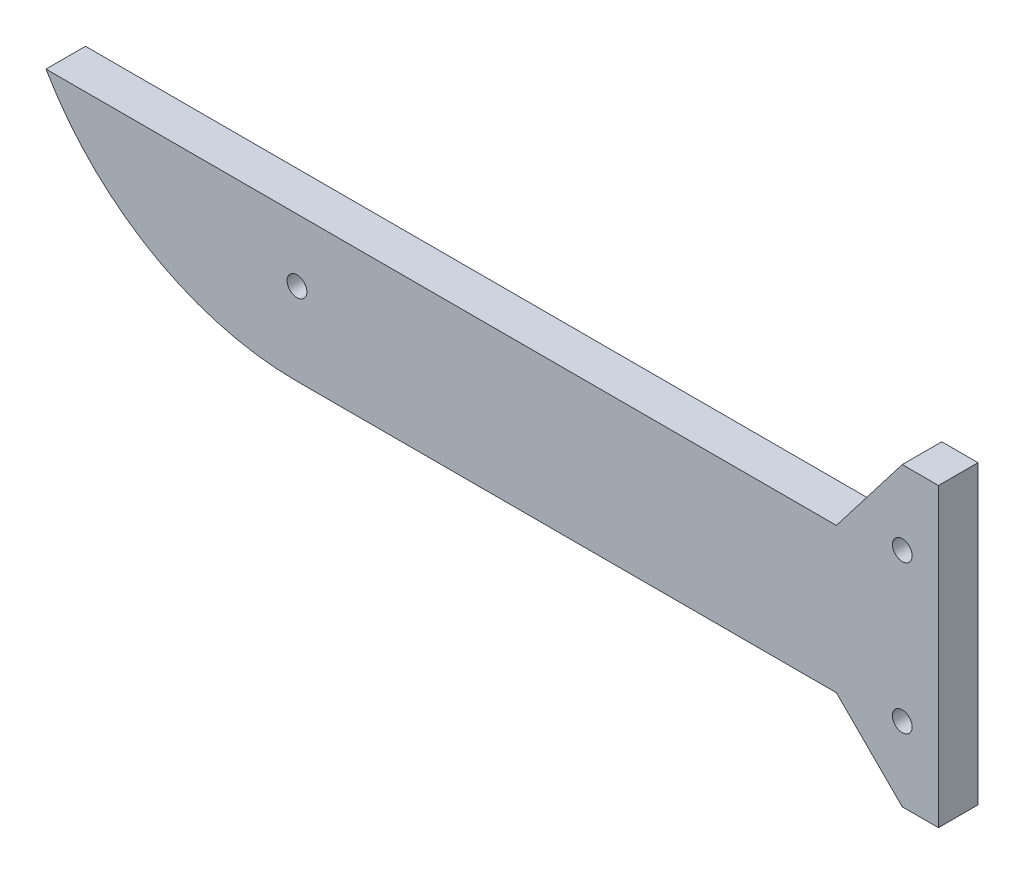
ISO-10303-21;
HEADER;
FILE_DESCRIPTION(('STEP AP214'),'2;1');
FILE_NAME('part.step','',(''),(''),'','','');
FILE_SCHEMA(('AUTOMOTIVE_DESIGN { 1 0 10303 214 1 1 1 1 }'));
ENDSEC;
DATA;
#1=APPLICATION_CONTEXT('core data for automotive mechanical design processes');
#2=APPLICATION_PROTOCOL_DEFINITION('international standard','automotive_design',2000,#1);
#3=PRODUCT_CONTEXT('',#1,'mechanical');
#4=PRODUCT('Part','Part','',(#3));
#5=PRODUCT_RELATED_PRODUCT_CATEGORY('part','',(#4));
#6=PRODUCT_DEFINITION_FORMATION('','',#4);
#7=PRODUCT_DEFINITION_CONTEXT('part definition',#1,'design');
#8=PRODUCT_DEFINITION('design','',#6,#7);
#9=PRODUCT_DEFINITION_SHAPE('','',#8);
#10=(LENGTH_UNIT() NAMED_UNIT(*) SI_UNIT(.MILLI.,.METRE.));
#11=(NAMED_UNIT(*) PLANE_ANGLE_UNIT() SI_UNIT($,.RADIAN.));
#12=(NAMED_UNIT(*) SI_UNIT($,.STERADIAN.) SOLID_ANGLE_UNIT());
#13=UNCERTAINTY_MEASURE_WITH_UNIT(LENGTH_MEASURE(1.E-05),#10,'distance_accuracy_value','');
#14=(GEOMETRIC_REPRESENTATION_CONTEXT(3) GLOBAL_UNCERTAINTY_ASSIGNED_CONTEXT((#13)) GLOBAL_UNIT_ASSIGNED_CONTEXT((#10,
#11,#12)) REPRESENTATION_CONTEXT('',''));
#15=CARTESIAN_POINT('',(0.,0.,0.));
#16=DIRECTION('',(0.,0.,1.));
#17=DIRECTION('',(1.,0.,0.));
#18=AXIS2_PLACEMENT_3D('',#15,#16,#17);
#19=CARTESIAN_POINT('',(38.1051177665153,19.,6.));
#20=DIRECTION('',(0.,0.,1.));
#21=DIRECTION('',(1.,0.,0.));
#22=AXIS2_PLACEMENT_3D('',#19,#20,#21);
#23=PLANE('',#22);
#24=CARTESIAN_POINT('',(130.,-23.75,6.));
#25=DIRECTION('',(0.,0.,1.));
#26=DIRECTION('',(1.,0.,0.));
#27=AXIS2_PLACEMENT_3D('',#24,#25,#26);
#28=CIRCLE('',#27,1.5);
#29=CARTESIAN_POINT('',(131.5,-23.75,6.));
#30=VERTEX_POINT('',#29);
#31=EDGE_CURVE('E179',#30,#30,#28,.T.);
#32=ORIENTED_EDGE('',*,*,#31,.F.);
#33=EDGE_LOOP('',(#32));
#34=FACE_BOUND('',#33,.T.);
#35=CARTESIAN_POINT('',(38.1051177665153,19.,6.));
#36=DIRECTION('',(0.,0.,1.));
#37=DIRECTION('',(1.,0.,0.));
#38=AXIS2_PLACEMENT_3D('',#35,#36,#37);
#39=CIRCLE('',#38,44.);
#40=CARTESIAN_POINT('',(0.,-3.,6.));
#41=VERTEX_POINT('',#40);
#42=CARTESIAN_POINT('',(38.1051177665153,-25.,6.));
#43=VERTEX_POINT('',#42);
#44=EDGE_CURVE('E142',#41,#43,#39,.T.);
#45=ORIENTED_EDGE('',*,*,#44,.T.);
#46=DIRECTION('',(1.,0.,0.));
#47=VECTOR('',#46,1.);
#48=CARTESIAN_POINT('',(120.,-25.,6.));
#49=LINE('',#48,#47);
#50=CARTESIAN_POINT('',(120.,-25.,6.));
#51=VERTEX_POINT('',#50);
#52=EDGE_CURVE('E90',#43,#51,#49,.T.);
#53=ORIENTED_EDGE('',*,*,#52,.T.);
#54=DIRECTION('',(0.707106781186546,-0.707106781186549,0.));
#55=VECTOR('',#54,1.);
#56=CARTESIAN_POINT('',(130.,-35.,6.));
#57=LINE('',#56,#55);
#58=CARTESIAN_POINT('',(130.,-35.,6.));
#59=VERTEX_POINT('',#58);
#60=EDGE_CURVE('E157',#51,#59,#57,.T.);
#61=ORIENTED_EDGE('',*,*,#60,.T.);
#62=DIRECTION('',(1.,0.,0.));
#63=VECTOR('',#62,1.);
#64=CARTESIAN_POINT('',(135.5,-35.,6.));
#65=LINE('',#64,#63);
#66=CARTESIAN_POINT('',(135.5,-35.,6.));
#67=VERTEX_POINT('',#66);
#68=EDGE_CURVE('E170',#59,#67,#65,.T.);
#69=ORIENTED_EDGE('',*,*,#68,.T.);
#70=DIRECTION('',(0.,1.,0.));
#71=VECTOR('',#70,1.);
#72=CARTESIAN_POINT('',(135.5,10.,6.));
#73=LINE('',#72,#71);
#74=CARTESIAN_POINT('',(135.5,10.,6.));
#75=VERTEX_POINT('',#74);
#76=EDGE_CURVE('E109',#67,#75,#73,.T.);
#77=ORIENTED_EDGE('',*,*,#76,.T.);
#78=DIRECTION('',(-1.,0.,0.));
#79=VECTOR('',#78,1.);
#80=CARTESIAN_POINT('',(130.,10.,6.));
#81=LINE('',#80,#79);
#82=CARTESIAN_POINT('',(130.,10.,6.));
#83=VERTEX_POINT('',#82);
#84=EDGE_CURVE('E103',#75,#83,#81,.T.);
#85=ORIENTED_EDGE('',*,*,#84,.T.);
#86=DIRECTION('',(-0.60971076084969,-0.792623989104602,0.));
#87=VECTOR('',#86,1.);
#88=CARTESIAN_POINT('',(120.,-3.,6.));
#89=LINE('',#88,#87);
#90=CARTESIAN_POINT('',(120.,-3.,6.));
#91=VERTEX_POINT('',#90);
#92=EDGE_CURVE('E107',#83,#91,#89,.T.);
#93=ORIENTED_EDGE('',*,*,#92,.T.);
#94=DIRECTION('',(-1.,0.,0.));
#95=VECTOR('',#94,1.);
#96=CARTESIAN_POINT('',(0.,-3.,6.));
#97=LINE('',#96,#95);
#98=EDGE_CURVE('E47',#91,#41,#97,.T.);
#99=ORIENTED_EDGE('',*,*,#98,.T.);
#100=EDGE_LOOP('',(#45,#53,#61,#69,#77,#85,#93,#99));
#101=FACE_BOUND('',#100,.T.);
#102=CARTESIAN_POINT('',(130.,-1.25,6.));
#103=DIRECTION('',(0.,0.,1.));
#104=DIRECTION('',(1.,0.,0.));
#105=AXIS2_PLACEMENT_3D('',#102,#103,#104);
#106=CIRCLE('',#105,1.5);
#107=CARTESIAN_POINT('',(131.5,-1.25,6.));
#108=VERTEX_POINT('',#107);
#109=EDGE_CURVE('E131',#108,#108,#106,.T.);
#110=ORIENTED_EDGE('',*,*,#109,.F.);
#111=EDGE_LOOP('',(#110));
#112=FACE_BOUND('',#111,.T.);
#113=CARTESIAN_POINT('',(38.1051177665153,-12.5,6.));
#114=DIRECTION('',(0.,0.,1.));
#115=DIRECTION('',(1.,0.,0.));
#116=AXIS2_PLACEMENT_3D('',#113,#114,#115);
#117=CIRCLE('',#116,1.5);
#118=CARTESIAN_POINT('',(39.6051177665153,-12.5,6.));
#119=VERTEX_POINT('',#118);
#120=EDGE_CURVE('E185',#119,#119,#117,.T.);
#121=ORIENTED_EDGE('',*,*,#120,.F.);
#122=EDGE_LOOP('',(#121));
#123=FACE_BOUND('',#122,.T.);
#124=ADVANCED_FACE('F30',(#34,#101,#112,#123),#23,.T.);
#125=CARTESIAN_POINT('',(38.1051177665153,19.,0.));
#126=DIRECTION('',(0.,0.,1.));
#127=DIRECTION('',(1.,0.,0.));
#128=AXIS2_PLACEMENT_3D('',#125,#126,#127);
#129=PLANE('',#128);
#130=CARTESIAN_POINT('',(38.1051177665153,19.,0.));
#131=DIRECTION('',(0.,0.,1.));
#132=DIRECTION('',(1.,0.,0.));
#133=AXIS2_PLACEMENT_3D('',#130,#131,#132);
#134=CIRCLE('',#133,44.);
#135=CARTESIAN_POINT('',(0.,-3.,0.));
#136=VERTEX_POINT('',#135);
#137=CARTESIAN_POINT('',(38.1051177665153,-25.,0.));
#138=VERTEX_POINT('',#137);
#139=EDGE_CURVE('E127',#136,#138,#134,.T.);
#140=ORIENTED_EDGE('',*,*,#139,.F.);
#141=DIRECTION('',(-1.,0.,0.));
#142=VECTOR('',#141,1.);
#143=CARTESIAN_POINT('',(0.,-3.,0.));
#144=LINE('',#143,#142);
#145=CARTESIAN_POINT('',(120.,-3.,0.));
#146=VERTEX_POINT('',#145);
#147=EDGE_CURVE('E82',#146,#136,#144,.T.);
#148=ORIENTED_EDGE('',*,*,#147,.F.);
#149=DIRECTION('',(-0.60971076084969,-0.792623989104602,0.));
#150=VECTOR('',#149,1.);
#151=CARTESIAN_POINT('',(120.,-3.,0.));
#152=LINE('',#151,#150);
#153=CARTESIAN_POINT('',(130.,10.,0.));
#154=VERTEX_POINT('',#153);
#155=EDGE_CURVE('E76',#154,#146,#152,.T.);
#156=ORIENTED_EDGE('',*,*,#155,.F.);
#157=DIRECTION('',(-1.,0.,0.));
#158=VECTOR('',#157,1.);
#159=CARTESIAN_POINT('',(130.,10.,0.));
#160=LINE('',#159,#158);
#161=CARTESIAN_POINT('',(135.5,10.,0.));
#162=VERTEX_POINT('',#161);
#163=EDGE_CURVE('E117',#162,#154,#160,.T.);
#164=ORIENTED_EDGE('',*,*,#163,.F.);
#165=DIRECTION('',(0.,1.,0.));
#166=VECTOR('',#165,1.);
#167=CARTESIAN_POINT('',(135.5,10.,0.));
#168=LINE('',#167,#166);
#169=CARTESIAN_POINT('',(135.5,-35.,0.));
#170=VERTEX_POINT('',#169);
#171=EDGE_CURVE('E137',#170,#162,#168,.T.);
#172=ORIENTED_EDGE('',*,*,#171,.F.);
#173=DIRECTION('',(1.,0.,0.));
#174=VECTOR('',#173,1.);
#175=CARTESIAN_POINT('',(135.5,-35.,0.));
#176=LINE('',#175,#174);
#177=CARTESIAN_POINT('',(130.,-35.,0.));
#178=VERTEX_POINT('',#177);
#179=EDGE_CURVE('E135',#178,#170,#176,.T.);
#180=ORIENTED_EDGE('',*,*,#179,.F.);
#181=DIRECTION('',(0.707106781186546,-0.707106781186549,0.));
#182=VECTOR('',#181,1.);
#183=CARTESIAN_POINT('',(130.,-35.,0.));
#184=LINE('',#183,#182);
#185=CARTESIAN_POINT('',(120.,-25.,0.));
#186=VERTEX_POINT('',#185);
#187=EDGE_CURVE('E133',#186,#178,#184,.T.);
#188=ORIENTED_EDGE('',*,*,#187,.F.);
#189=DIRECTION('',(1.,0.,0.));
#190=VECTOR('',#189,1.);
#191=CARTESIAN_POINT('',(120.,-25.,0.));
#192=LINE('',#191,#190);
#193=EDGE_CURVE('E130',#138,#186,#192,.T.);
#194=ORIENTED_EDGE('',*,*,#193,.F.);
#195=EDGE_LOOP('',(#140,#148,#156,#164,#172,#180,#188,#194));
#196=FACE_BOUND('',#195,.T.);
#197=CARTESIAN_POINT('',(130.,-1.25,0.));
#198=DIRECTION('',(0.,0.,1.));
#199=DIRECTION('',(1.,0.,0.));
#200=AXIS2_PLACEMENT_3D('',#197,#198,#199);
#201=CIRCLE('',#200,1.5);
#202=CARTESIAN_POINT('',(131.5,-1.25,0.));
#203=VERTEX_POINT('',#202);
#204=EDGE_CURVE('E176',#203,#203,#201,.T.);
#205=ORIENTED_EDGE('',*,*,#204,.T.);
#206=EDGE_LOOP('',(#205));
#207=FACE_BOUND('',#206,.T.);
#208=CARTESIAN_POINT('',(130.,-23.75,0.));
#209=DIRECTION('',(0.,0.,1.));
#210=DIRECTION('',(1.,0.,0.));
#211=AXIS2_PLACEMENT_3D('',#208,#209,#210);
#212=CIRCLE('',#211,1.5);
#213=CARTESIAN_POINT('',(131.5,-23.75,0.));
#214=VERTEX_POINT('',#213);
#215=EDGE_CURVE('E182',#214,#214,#212,.T.);
#216=ORIENTED_EDGE('',*,*,#215,.T.);
#217=EDGE_LOOP('',(#216));
#218=FACE_BOUND('',#217,.T.);
#219=CARTESIAN_POINT('',(38.1051177665153,-12.5,0.));
#220=DIRECTION('',(0.,0.,1.));
#221=DIRECTION('',(1.,0.,0.));
#222=AXIS2_PLACEMENT_3D('',#219,#220,#221);
#223=CIRCLE('',#222,1.5);
#224=CARTESIAN_POINT('',(39.6051177665153,-12.5,0.));
#225=VERTEX_POINT('',#224);
#226=EDGE_CURVE('E188',#225,#225,#223,.T.);
#227=ORIENTED_EDGE('',*,*,#226,.T.);
#228=EDGE_LOOP('',(#227));
#229=FACE_BOUND('',#228,.T.);
#230=ADVANCED_FACE('F161',(#196,#207,#218,#229),#129,.F.);
#231=CARTESIAN_POINT('',(38.1051177665153,19.,6.));
#232=DIRECTION('',(0.,0.,-1.));
#233=DIRECTION('',(-1.,0.,0.));
#234=AXIS2_PLACEMENT_3D('',#231,#232,#233);
#235=CYLINDRICAL_SURFACE('',#234,44.);
#236=ORIENTED_EDGE('',*,*,#139,.T.);
#237=DIRECTION('',(0.,0.,-1.));
#238=VECTOR('',#237,1.);
#239=CARTESIAN_POINT('',(38.1051177665153,-25.,6.));
#240=LINE('',#239,#238);
#241=EDGE_CURVE('E11',#43,#138,#240,.T.);
#242=ORIENTED_EDGE('',*,*,#241,.F.);
#243=ORIENTED_EDGE('',*,*,#44,.F.);
#244=DIRECTION('',(0.,0.,-1.));
#245=VECTOR('',#244,1.);
#246=CARTESIAN_POINT('',(0.,-3.,6.));
#247=LINE('',#246,#245);
#248=EDGE_CURVE('E123',#41,#136,#247,.T.);
#249=ORIENTED_EDGE('',*,*,#248,.T.);
#250=EDGE_LOOP('',(#236,#242,#243,#249));
#251=FACE_BOUND('',#250,.T.);
#252=ADVANCED_FACE('F32',(#251),#235,.T.);
#253=CARTESIAN_POINT('',(120.,-25.,6.));
#254=DIRECTION('',(0.,1.,0.));
#255=DIRECTION('',(0.,0.,1.));
#256=AXIS2_PLACEMENT_3D('',#253,#254,#255);
#257=PLANE('',#256);
#258=ORIENTED_EDGE('',*,*,#193,.T.);
#259=DIRECTION('',(0.,0.,-1.));
#260=VECTOR('',#259,1.);
#261=CARTESIAN_POINT('',(120.,-25.,6.));
#262=LINE('',#261,#260);
#263=EDGE_CURVE('E39',#51,#186,#262,.T.);
#264=ORIENTED_EDGE('',*,*,#263,.F.);
#265=ORIENTED_EDGE('',*,*,#52,.F.);
#266=ORIENTED_EDGE('',*,*,#241,.T.);
#267=EDGE_LOOP('',(#258,#264,#265,#266));
#268=FACE_BOUND('',#267,.T.);
#269=ADVANCED_FACE('F221',(#268),#257,.F.);
#270=CARTESIAN_POINT('',(130.,-35.,6.));
#271=DIRECTION('',(0.707106781186549,0.707106781186545,0.));
#272=DIRECTION('',(-0.707106781186546,0.707106781186549,0.));
#273=AXIS2_PLACEMENT_3D('',#270,#271,#272);
#274=PLANE('',#273);
#275=ORIENTED_EDGE('',*,*,#187,.T.);
#276=DIRECTION('',(0.,0.,-1.));
#277=VECTOR('',#276,1.);
#278=CARTESIAN_POINT('',(130.,-35.,6.));
#279=LINE('',#278,#277);
#280=EDGE_CURVE('E149',#59,#178,#279,.T.);
#281=ORIENTED_EDGE('',*,*,#280,.F.);
#282=ORIENTED_EDGE('',*,*,#60,.F.);
#283=ORIENTED_EDGE('',*,*,#263,.T.);
#284=EDGE_LOOP('',(#275,#281,#282,#283));
#285=FACE_BOUND('',#284,.T.);
#286=ADVANCED_FACE('F155',(#285),#274,.F.);
#287=CARTESIAN_POINT('',(135.5,-35.,6.));
#288=DIRECTION('',(0.,1.,0.));
#289=DIRECTION('',(0.,0.,1.));
#290=AXIS2_PLACEMENT_3D('',#287,#288,#289);
#291=PLANE('',#290);
#292=ORIENTED_EDGE('',*,*,#179,.T.);
#293=DIRECTION('',(0.,0.,-1.));
#294=VECTOR('',#293,1.);
#295=CARTESIAN_POINT('',(135.5,-35.,6.));
#296=LINE('',#295,#294);
#297=EDGE_CURVE('E146',#67,#170,#296,.T.);
#298=ORIENTED_EDGE('',*,*,#297,.F.);
#299=ORIENTED_EDGE('',*,*,#68,.F.);
#300=ORIENTED_EDGE('',*,*,#280,.T.);
#301=EDGE_LOOP('',(#292,#298,#299,#300));
#302=FACE_BOUND('',#301,.T.);
#303=ADVANCED_FACE('F166',(#302),#291,.F.);
#304=CARTESIAN_POINT('',(135.5,10.,6.));
#305=DIRECTION('',(-1.,0.,0.));
#306=DIRECTION('',(0.,0.,1.));
#307=AXIS2_PLACEMENT_3D('',#304,#305,#306);
#308=PLANE('',#307);
#309=ORIENTED_EDGE('',*,*,#171,.T.);
#310=DIRECTION('',(0.,0.,-1.));
#311=VECTOR('',#310,1.);
#312=CARTESIAN_POINT('',(135.5,10.,6.));
#313=LINE('',#312,#311);
#314=EDGE_CURVE('E118',#75,#162,#313,.T.);
#315=ORIENTED_EDGE('',*,*,#314,.F.);
#316=ORIENTED_EDGE('',*,*,#76,.F.);
#317=ORIENTED_EDGE('',*,*,#297,.T.);
#318=EDGE_LOOP('',(#309,#315,#316,#317));
#319=FACE_BOUND('',#318,.T.);
#320=ADVANCED_FACE('F169',(#319),#308,.F.);
#321=CARTESIAN_POINT('',(130.,10.,6.));
#322=DIRECTION('',(0.,-1.,0.));
#323=DIRECTION('',(0.,0.,-1.));
#324=AXIS2_PLACEMENT_3D('',#321,#322,#323);
#325=PLANE('',#324);
#326=ORIENTED_EDGE('',*,*,#163,.T.);
#327=DIRECTION('',(0.,0.,-1.));
#328=VECTOR('',#327,1.);
#329=CARTESIAN_POINT('',(130.,10.,6.));
#330=LINE('',#329,#328);
#331=EDGE_CURVE('E114',#83,#154,#330,.T.);
#332=ORIENTED_EDGE('',*,*,#331,.F.);
#333=ORIENTED_EDGE('',*,*,#84,.F.);
#334=ORIENTED_EDGE('',*,*,#314,.T.);
#335=EDGE_LOOP('',(#326,#332,#333,#334));
#336=FACE_BOUND('',#335,.T.);
#337=ADVANCED_FACE('F115',(#336),#325,.F.);
#338=CARTESIAN_POINT('',(120.,-3.,6.));
#339=DIRECTION('',(0.792623989104602,-0.60971076084969,0.));
#340=DIRECTION('',(0.60971076084969,0.792623989104602,0.));
#341=AXIS2_PLACEMENT_3D('',#338,#339,#340);
#342=PLANE('',#341);
#343=ORIENTED_EDGE('',*,*,#155,.T.);
#344=DIRECTION('',(0.,0.,-1.));
#345=VECTOR('',#344,1.);
#346=CARTESIAN_POINT('',(120.,-3.,6.));
#347=LINE('',#346,#345);
#348=EDGE_CURVE('E119',#91,#146,#347,.T.);
#349=ORIENTED_EDGE('',*,*,#348,.F.);
#350=ORIENTED_EDGE('',*,*,#92,.F.);
#351=ORIENTED_EDGE('',*,*,#331,.T.);
#352=EDGE_LOOP('',(#343,#349,#350,#351));
#353=FACE_BOUND('',#352,.T.);
#354=ADVANCED_FACE('F121',(#353),#342,.F.);
#355=CARTESIAN_POINT('',(0.,-3.,6.));
#356=DIRECTION('',(0.,-1.,0.));
#357=DIRECTION('',(1.,0.,0.));
#358=AXIS2_PLACEMENT_3D('',#355,#356,#357);
#359=PLANE('',#358);
#360=ORIENTED_EDGE('',*,*,#147,.T.);
#361=ORIENTED_EDGE('',*,*,#248,.F.);
#362=ORIENTED_EDGE('',*,*,#98,.F.);
#363=ORIENTED_EDGE('',*,*,#348,.T.);
#364=EDGE_LOOP('',(#360,#361,#362,#363));
#365=FACE_BOUND('',#364,.T.);
#366=ADVANCED_FACE('F209',(#365),#359,.F.);
#367=CARTESIAN_POINT('',(130.,-1.25,6.));
#368=DIRECTION('',(0.,0.,-1.));
#369=DIRECTION('',(-1.,0.,0.));
#370=AXIS2_PLACEMENT_3D('',#367,#368,#369);
#371=CYLINDRICAL_SURFACE('',#370,1.5);
#372=ORIENTED_EDGE('',*,*,#109,.T.);
#373=EDGE_LOOP('',(#372));
#374=FACE_BOUND('',#373,.T.);
#375=ORIENTED_EDGE('',*,*,#204,.F.);
#376=EDGE_LOOP('',(#375));
#377=FACE_BOUND('',#376,.T.);
#378=ADVANCED_FACE('F206',(#374,#377),#371,.F.);
#379=CARTESIAN_POINT('',(130.,-23.75,6.));
#380=DIRECTION('',(0.,0.,-1.));
#381=DIRECTION('',(-1.,0.,0.));
#382=AXIS2_PLACEMENT_3D('',#379,#380,#381);
#383=CYLINDRICAL_SURFACE('',#382,1.5);
#384=ORIENTED_EDGE('',*,*,#31,.T.);
#385=EDGE_LOOP('',(#384));
#386=FACE_BOUND('',#385,.T.);
#387=ORIENTED_EDGE('',*,*,#215,.F.);
#388=EDGE_LOOP('',(#387));
#389=FACE_BOUND('',#388,.T.);
#390=ADVANCED_FACE('F285',(#386,#389),#383,.F.);
#391=CARTESIAN_POINT('',(38.1051177665153,-12.5,6.));
#392=DIRECTION('',(0.,0.,-1.));
#393=DIRECTION('',(-1.,0.,0.));
#394=AXIS2_PLACEMENT_3D('',#391,#392,#393);
#395=CYLINDRICAL_SURFACE('',#394,1.5);
#396=ORIENTED_EDGE('',*,*,#120,.T.);
#397=EDGE_LOOP('',(#396));
#398=FACE_BOUND('',#397,.T.);
#399=ORIENTED_EDGE('',*,*,#226,.F.);
#400=EDGE_LOOP('',(#399));
#401=FACE_BOUND('',#400,.T.);
#402=ADVANCED_FACE('F194',(#398,#401),#395,.F.);
#403=CLOSED_SHELL('',(#124,#230,#252,#269,#286,#303,#320,#337,#354,#366,#378,#390,#402));
#404=MANIFOLD_SOLID_BREP('B2',#403);
#405=ADVANCED_BREP_SHAPE_REPRESENTATION('',(#18,#404),#14);
#406=SHAPE_DEFINITION_REPRESENTATION(#9,#405);
ENDSEC;
END-ISO-10303-21;
